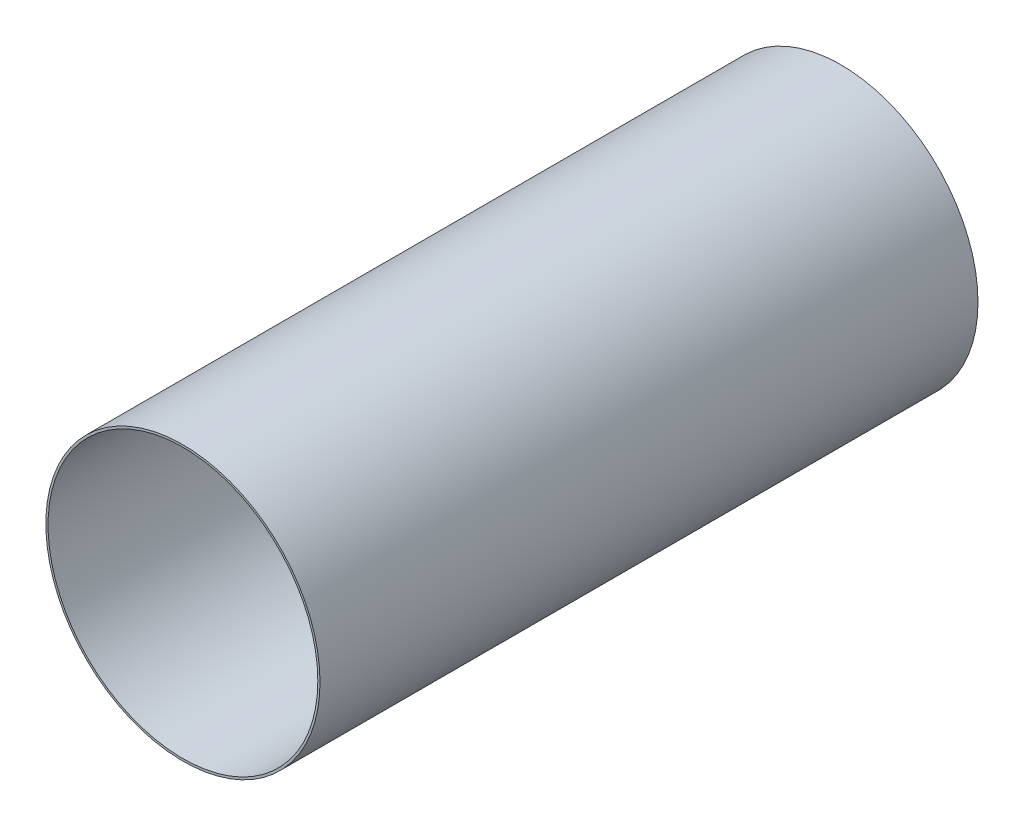
ISO-10303-21;
HEADER;
FILE_DESCRIPTION(('STEP AP214'),'2;1');
FILE_NAME('part.step','',(''),(''),'','','');
FILE_SCHEMA(('AUTOMOTIVE_DESIGN { 1 0 10303 214 1 1 1 1 }'));
ENDSEC;
DATA;
#1=APPLICATION_CONTEXT('core data for automotive mechanical design processes');
#2=APPLICATION_PROTOCOL_DEFINITION('international standard','automotive_design',2000,#1);
#3=PRODUCT_CONTEXT('',#1,'mechanical');
#4=PRODUCT('Part','Part','',(#3));
#5=PRODUCT_RELATED_PRODUCT_CATEGORY('part','',(#4));
#6=PRODUCT_DEFINITION_FORMATION('','',#4);
#7=PRODUCT_DEFINITION_CONTEXT('part definition',#1,'design');
#8=PRODUCT_DEFINITION('design','',#6,#7);
#9=PRODUCT_DEFINITION_SHAPE('','',#8);
#10=(LENGTH_UNIT() NAMED_UNIT(*) SI_UNIT(.MILLI.,.METRE.));
#11=(NAMED_UNIT(*) PLANE_ANGLE_UNIT() SI_UNIT($,.RADIAN.));
#12=(NAMED_UNIT(*) SI_UNIT($,.STERADIAN.) SOLID_ANGLE_UNIT());
#13=UNCERTAINTY_MEASURE_WITH_UNIT(LENGTH_MEASURE(1.E-05),#10,'distance_accuracy_value','');
#14=(GEOMETRIC_REPRESENTATION_CONTEXT(3) GLOBAL_UNCERTAINTY_ASSIGNED_CONTEXT((#13)) GLOBAL_UNIT_ASSIGNED_CONTEXT((#10,
#11,#12)) REPRESENTATION_CONTEXT('',''));
#15=CARTESIAN_POINT('',(0.,0.,0.));
#16=DIRECTION('',(0.,0.,1.));
#17=DIRECTION('',(1.,0.,0.));
#18=AXIS2_PLACEMENT_3D('',#15,#16,#17);
#19=CARTESIAN_POINT('',(0.,0.,150.));
#20=DIRECTION('',(0.,0.,1.));
#21=DIRECTION('',(1.,0.,0.));
#22=AXIS2_PLACEMENT_3D('',#19,#20,#21);
#23=PLANE('',#22);
#24=CARTESIAN_POINT('',(0.,0.,150.));
#25=DIRECTION('',(0.,0.,1.));
#26=DIRECTION('',(1.,0.,0.));
#27=AXIS2_PLACEMENT_3D('',#24,#25,#26);
#28=CIRCLE('',#27,62.5);
#29=CARTESIAN_POINT('',(62.5,0.,150.));
#30=VERTEX_POINT('',#29);
#31=EDGE_CURVE('E10',#30,#30,#28,.T.);
#32=ORIENTED_EDGE('',*,*,#31,.T.);
#33=EDGE_LOOP('',(#32));
#34=FACE_BOUND('',#33,.T.);
#35=CARTESIAN_POINT('',(0.,0.,150.));
#36=DIRECTION('',(0.,0.,1.));
#37=DIRECTION('',(1.,0.,0.));
#38=AXIS2_PLACEMENT_3D('',#35,#36,#37);
#39=CIRCLE('',#38,61.5);
#40=CARTESIAN_POINT('',(61.5,0.,150.));
#41=VERTEX_POINT('',#40);
#42=EDGE_CURVE('E56',#41,#41,#39,.T.);
#43=ORIENTED_EDGE('',*,*,#42,.F.);
#44=EDGE_LOOP('',(#43));
#45=FACE_BOUND('',#44,.T.);
#46=ADVANCED_FACE('F43',(#34,#45),#23,.T.);
#47=CARTESIAN_POINT('',(0.,0.,-150.));
#48=DIRECTION('',(0.,0.,1.));
#49=DIRECTION('',(1.,0.,0.));
#50=AXIS2_PLACEMENT_3D('',#47,#48,#49);
#51=PLANE('',#50);
#52=CARTESIAN_POINT('',(0.,0.,-150.));
#53=DIRECTION('',(0.,0.,1.));
#54=DIRECTION('',(1.,0.,0.));
#55=AXIS2_PLACEMENT_3D('',#52,#53,#54);
#56=CIRCLE('',#55,62.5);
#57=CARTESIAN_POINT('',(62.5,0.,-150.));
#58=VERTEX_POINT('',#57);
#59=EDGE_CURVE('E47',#58,#58,#56,.T.);
#60=ORIENTED_EDGE('',*,*,#59,.F.);
#61=EDGE_LOOP('',(#60));
#62=FACE_BOUND('',#61,.T.);
#63=CARTESIAN_POINT('',(0.,0.,-150.));
#64=DIRECTION('',(0.,0.,1.));
#65=DIRECTION('',(1.,0.,0.));
#66=AXIS2_PLACEMENT_3D('',#63,#64,#65);
#67=CIRCLE('',#66,61.5);
#68=CARTESIAN_POINT('',(61.5,0.,-150.));
#69=VERTEX_POINT('',#68);
#70=EDGE_CURVE('E58',#69,#69,#67,.T.);
#71=ORIENTED_EDGE('',*,*,#70,.T.);
#72=EDGE_LOOP('',(#71));
#73=FACE_BOUND('',#72,.T.);
#74=ADVANCED_FACE('F70',(#62,#73),#51,.F.);
#75=CARTESIAN_POINT('',(0.,0.,150.));
#76=DIRECTION('',(0.,0.,-1.));
#77=DIRECTION('',(-1.,0.,0.));
#78=AXIS2_PLACEMENT_3D('',#75,#76,#77);
#79=CYLINDRICAL_SURFACE('',#78,62.5);
#80=ORIENTED_EDGE('',*,*,#31,.F.);
#81=EDGE_LOOP('',(#80));
#82=FACE_BOUND('',#81,.T.);
#83=ORIENTED_EDGE('',*,*,#59,.T.);
#84=EDGE_LOOP('',(#83));
#85=FACE_BOUND('',#84,.T.);
#86=ADVANCED_FACE('F45',(#82,#85),#79,.T.);
#87=CARTESIAN_POINT('',(0.,0.,150.));
#88=DIRECTION('',(0.,0.,-1.));
#89=DIRECTION('',(-1.,0.,0.));
#90=AXIS2_PLACEMENT_3D('',#87,#88,#89);
#91=CYLINDRICAL_SURFACE('',#90,61.5);
#92=ORIENTED_EDGE('',*,*,#42,.T.);
#93=EDGE_LOOP('',(#92));
#94=FACE_BOUND('',#93,.T.);
#95=ORIENTED_EDGE('',*,*,#70,.F.);
#96=EDGE_LOOP('',(#95));
#97=FACE_BOUND('',#96,.T.);
#98=ADVANCED_FACE('F66',(#94,#97),#91,.F.);
#99=CLOSED_SHELL('',(#46,#74,#86,#98));
#100=MANIFOLD_SOLID_BREP('B2',#99);
#101=ADVANCED_BREP_SHAPE_REPRESENTATION('',(#18,#100),#14);
#102=SHAPE_DEFINITION_REPRESENTATION(#9,#101);
ENDSEC;
END-ISO-10303-21;
